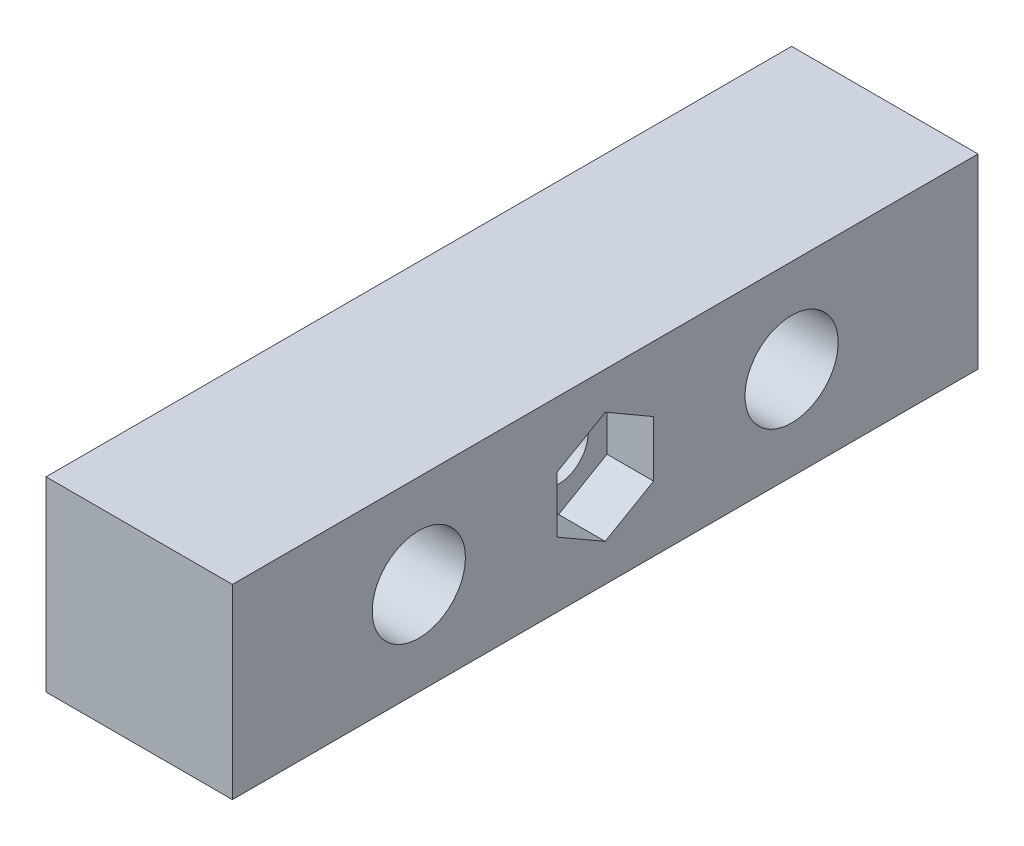
ISO-10303-21;
HEADER;
FILE_DESCRIPTION(('STEP AP214'),'2;1');
FILE_NAME('part.step','',(''),(''),'','','');
FILE_SCHEMA(('AUTOMOTIVE_DESIGN { 1 0 10303 214 1 1 1 1 }'));
ENDSEC;
DATA;
#1=APPLICATION_CONTEXT('core data for automotive mechanical design processes');
#2=APPLICATION_PROTOCOL_DEFINITION('international standard','automotive_design',2000,#1);
#3=PRODUCT_CONTEXT('',#1,'mechanical');
#4=PRODUCT('Part','Part','',(#3));
#5=PRODUCT_RELATED_PRODUCT_CATEGORY('part','',(#4));
#6=PRODUCT_DEFINITION_FORMATION('','',#4);
#7=PRODUCT_DEFINITION_CONTEXT('part definition',#1,'design');
#8=PRODUCT_DEFINITION('design','',#6,#7);
#9=PRODUCT_DEFINITION_SHAPE('','',#8);
#10=(LENGTH_UNIT() NAMED_UNIT(*) SI_UNIT(.MILLI.,.METRE.));
#11=(NAMED_UNIT(*) PLANE_ANGLE_UNIT() SI_UNIT($,.RADIAN.));
#12=(NAMED_UNIT(*) SI_UNIT($,.STERADIAN.) SOLID_ANGLE_UNIT());
#13=UNCERTAINTY_MEASURE_WITH_UNIT(LENGTH_MEASURE(1.E-05),#10,'distance_accuracy_value','');
#14=(GEOMETRIC_REPRESENTATION_CONTEXT(3) GLOBAL_UNCERTAINTY_ASSIGNED_CONTEXT((#13)) GLOBAL_UNIT_ASSIGNED_CONTEXT((#10,
#11,#12)) REPRESENTATION_CONTEXT('',''));
#15=CARTESIAN_POINT('',(0.,0.,0.));
#16=DIRECTION('',(0.,0.,1.));
#17=DIRECTION('',(1.,0.,0.));
#18=AXIS2_PLACEMENT_3D('',#15,#16,#17);
#19=CARTESIAN_POINT('',(-10.,10.,0.));
#20=DIRECTION('',(1.,0.,0.));
#21=DIRECTION('',(0.,0.,-1.));
#22=AXIS2_PLACEMENT_3D('',#19,#20,#21);
#23=CYLINDRICAL_SURFACE('',#22,3.175);
#24=CARTESIAN_POINT('',(5.,10.,0.));
#25=DIRECTION('',(1.,0.,0.));
#26=DIRECTION('',(0.,0.,-1.));
#27=AXIS2_PLACEMENT_3D('',#24,#25,#26);
#28=CIRCLE('',#27,3.175);
#29=CARTESIAN_POINT('',(5.,10.,-3.17500000000001));
#30=VERTEX_POINT('',#29);
#31=EDGE_CURVE('E243',#30,#30,#28,.F.);
#32=ORIENTED_EDGE('',*,*,#31,.F.);
#33=EDGE_LOOP('',(#32));
#34=FACE_BOUND('',#33,.T.);
#35=CARTESIAN_POINT('',(-5.,10.,0.));
#36=DIRECTION('',(-1.,0.,0.));
#37=DIRECTION('',(0.,0.,1.));
#38=AXIS2_PLACEMENT_3D('',#35,#36,#37);
#39=CIRCLE('',#38,3.175);
#40=CARTESIAN_POINT('',(-5.,10.,3.17499999999999));
#41=VERTEX_POINT('',#40);
#42=EDGE_CURVE('E41',#41,#41,#39,.F.);
#43=ORIENTED_EDGE('',*,*,#42,.F.);
#44=EDGE_LOOP('',(#43));
#45=FACE_BOUND('',#44,.T.);
#46=ADVANCED_FACE('F37',(#34,#45),#23,.F.);
#47=CARTESIAN_POINT('',(-10.,20.,40.));
#48=DIRECTION('',(1.,0.,0.));
#49=DIRECTION('',(0.,0.,-1.));
#50=AXIS2_PLACEMENT_3D('',#47,#48,#49);
#51=PLANE('',#50);
#52=DIRECTION('',(0.,0.,1.));
#53=VECTOR('',#52,1.);
#54=CARTESIAN_POINT('',(-10.,0.,40.));
#55=LINE('',#54,#53);
#56=CARTESIAN_POINT('',(-10.,0.,-40.));
#57=VERTEX_POINT('',#56);
#58=CARTESIAN_POINT('',(-10.,0.,40.));
#59=VERTEX_POINT('',#58);
#60=EDGE_CURVE('E281',#57,#59,#55,.T.);
#61=ORIENTED_EDGE('',*,*,#60,.T.);
#62=DIRECTION('',(0.,-1.,0.));
#63=VECTOR('',#62,1.);
#64=CARTESIAN_POINT('',(-10.,20.,40.));
#65=LINE('',#64,#63);
#66=CARTESIAN_POINT('',(-10.,20.,40.));
#67=VERTEX_POINT('',#66);
#68=EDGE_CURVE('E286',#67,#59,#65,.T.);
#69=ORIENTED_EDGE('',*,*,#68,.F.);
#70=DIRECTION('',(0.,0.,1.));
#71=VECTOR('',#70,1.);
#72=CARTESIAN_POINT('',(-10.,20.,40.));
#73=LINE('',#72,#71);
#74=CARTESIAN_POINT('',(-10.,20.,-40.));
#75=VERTEX_POINT('',#74);
#76=EDGE_CURVE('E272',#75,#67,#73,.T.);
#77=ORIENTED_EDGE('',*,*,#76,.F.);
#78=DIRECTION('',(0.,-1.,0.));
#79=VECTOR('',#78,1.);
#80=CARTESIAN_POINT('',(-10.,20.,-40.));
#81=LINE('',#80,#79);
#82=EDGE_CURVE('E46',#75,#57,#81,.T.);
#83=ORIENTED_EDGE('',*,*,#82,.T.);
#84=EDGE_LOOP('',(#61,#69,#77,#83));
#85=FACE_BOUND('',#84,.T.);
#86=CARTESIAN_POINT('',(-10.,10.,-20.));
#87=DIRECTION('',(1.,0.,0.));
#88=DIRECTION('',(0.,0.,1.));
#89=AXIS2_PLACEMENT_3D('',#86,#87,#88);
#90=CIRCLE('',#89,5.);
#91=CARTESIAN_POINT('',(-10.,10.,-15.));
#92=VERTEX_POINT('',#91);
#93=EDGE_CURVE('E260',#92,#92,#90,.T.);
#94=ORIENTED_EDGE('',*,*,#93,.T.);
#95=EDGE_LOOP('',(#94));
#96=FACE_BOUND('',#95,.T.);
#97=CARTESIAN_POINT('',(-10.,10.,20.));
#98=DIRECTION('',(1.,0.,0.));
#99=DIRECTION('',(0.,0.,-1.));
#100=AXIS2_PLACEMENT_3D('',#97,#98,#99);
#101=CIRCLE('',#100,5.);
#102=CARTESIAN_POINT('',(-10.,10.,15.));
#103=VERTEX_POINT('',#102);
#104=EDGE_CURVE('E253',#103,#103,#101,.T.);
#105=ORIENTED_EDGE('',*,*,#104,.T.);
#106=EDGE_LOOP('',(#105));
#107=FACE_BOUND('',#106,.T.);
#108=DIRECTION('',(0.,0.5,0.866025403784439));
#109=VECTOR('',#108,1.);
#110=CARTESIAN_POINT('',(-10.,13.,-5.19615242270664));
#111=LINE('',#110,#109);
#112=CARTESIAN_POINT('',(-10.,13.,-5.19615242270664));
#113=VERTEX_POINT('',#112);
#114=CARTESIAN_POINT('',(-10.,16.,0.));
#115=VERTEX_POINT('',#114);
#116=EDGE_CURVE('E54',#113,#115,#111,.T.);
#117=ORIENTED_EDGE('',*,*,#116,.T.);
#118=DIRECTION('',(0.,-0.5,0.866025403784438));
#119=VECTOR('',#118,1.);
#120=CARTESIAN_POINT('',(-10.,16.,0.));
#121=LINE('',#120,#119);
#122=CARTESIAN_POINT('',(-10.,13.,5.19615242270662));
#123=VERTEX_POINT('',#122);
#124=EDGE_CURVE('E174',#115,#123,#121,.T.);
#125=ORIENTED_EDGE('',*,*,#124,.T.);
#126=DIRECTION('',(0.,-1.,0.));
#127=VECTOR('',#126,1.);
#128=CARTESIAN_POINT('',(-10.,13.,5.19615242270662));
#129=LINE('',#128,#127);
#130=CARTESIAN_POINT('',(-10.,7.,5.19615242270662));
#131=VERTEX_POINT('',#130);
#132=EDGE_CURVE('E177',#123,#131,#129,.T.);
#133=ORIENTED_EDGE('',*,*,#132,.T.);
#134=DIRECTION('',(0.,-0.5,-0.866025403784438));
#135=VECTOR('',#134,1.);
#136=CARTESIAN_POINT('',(-10.,7.,5.19615242270662));
#137=LINE('',#136,#135);
#138=CARTESIAN_POINT('',(-10.,4.00000000000001,0.));
#139=VERTEX_POINT('',#138);
#140=EDGE_CURVE('E192',#131,#139,#137,.T.);
#141=ORIENTED_EDGE('',*,*,#140,.T.);
#142=DIRECTION('',(0.,0.5,-0.866025403784439));
#143=VECTOR('',#142,1.);
#144=CARTESIAN_POINT('',(-10.,4.00000000000001,0.));
#145=LINE('',#144,#143);
#146=CARTESIAN_POINT('',(-10.,7.,-5.19615242270664));
#147=VERTEX_POINT('',#146);
#148=EDGE_CURVE('E189',#139,#147,#145,.T.);
#149=ORIENTED_EDGE('',*,*,#148,.T.);
#150=DIRECTION('',(0.,1.,0.));
#151=VECTOR('',#150,1.);
#152=CARTESIAN_POINT('',(-10.,7.,-5.19615242270664));
#153=LINE('',#152,#151);
#154=EDGE_CURVE('E187',#147,#113,#153,.T.);
#155=ORIENTED_EDGE('',*,*,#154,.T.);
#156=EDGE_LOOP('',(#117,#125,#133,#141,#149,#155));
#157=FACE_BOUND('',#156,.T.);
#158=ADVANCED_FACE('F297',(#85,#96,#107,#157),#51,.F.);
#159=CARTESIAN_POINT('',(10.,20.,40.));
#160=DIRECTION('',(-1.,0.,0.));
#161=DIRECTION('',(0.,0.,1.));
#162=AXIS2_PLACEMENT_3D('',#159,#160,#161);
#163=PLANE('',#162);
#164=DIRECTION('',(0.,-0.5,0.866025403784438));
#165=VECTOR('',#164,1.);
#166=CARTESIAN_POINT('',(10.,16.,0.));
#167=LINE('',#166,#165);
#168=CARTESIAN_POINT('',(10.,16.,0.));
#169=VERTEX_POINT('',#168);
#170=CARTESIAN_POINT('',(10.,13.,5.19615242270662));
#171=VERTEX_POINT('',#170);
#172=EDGE_CURVE('E227',#169,#171,#167,.T.);
#173=ORIENTED_EDGE('',*,*,#172,.F.);
#174=DIRECTION('',(0.,0.5,0.866025403784439));
#175=VECTOR('',#174,1.);
#176=CARTESIAN_POINT('',(10.,13.,-5.19615242270664));
#177=LINE('',#176,#175);
#178=CARTESIAN_POINT('',(10.,13.,-5.19615242270664));
#179=VERTEX_POINT('',#178);
#180=EDGE_CURVE('E62',#179,#169,#177,.T.);
#181=ORIENTED_EDGE('',*,*,#180,.F.);
#182=DIRECTION('',(0.,1.,0.));
#183=VECTOR('',#182,1.);
#184=CARTESIAN_POINT('',(10.,7.,-5.19615242270664));
#185=LINE('',#184,#183);
#186=CARTESIAN_POINT('',(10.,7.,-5.19615242270664));
#187=VERTEX_POINT('',#186);
#188=EDGE_CURVE('E210',#187,#179,#185,.T.);
#189=ORIENTED_EDGE('',*,*,#188,.F.);
#190=DIRECTION('',(0.,0.5,-0.866025403784439));
#191=VECTOR('',#190,1.);
#192=CARTESIAN_POINT('',(10.,4.00000000000001,0.));
#193=LINE('',#192,#191);
#194=CARTESIAN_POINT('',(10.,4.00000000000001,0.));
#195=VERTEX_POINT('',#194);
#196=EDGE_CURVE('E236',#195,#187,#193,.T.);
#197=ORIENTED_EDGE('',*,*,#196,.F.);
#198=DIRECTION('',(0.,-0.5,-0.866025403784438));
#199=VECTOR('',#198,1.);
#200=CARTESIAN_POINT('',(10.,7.,5.19615242270662));
#201=LINE('',#200,#199);
#202=CARTESIAN_POINT('',(10.,7.,5.19615242270662));
#203=VERTEX_POINT('',#202);
#204=EDGE_CURVE('E233',#203,#195,#201,.T.);
#205=ORIENTED_EDGE('',*,*,#204,.F.);
#206=DIRECTION('',(0.,-1.,0.));
#207=VECTOR('',#206,1.);
#208=CARTESIAN_POINT('',(10.,13.,5.19615242270662));
#209=LINE('',#208,#207);
#210=EDGE_CURVE('E230',#171,#203,#209,.T.);
#211=ORIENTED_EDGE('',*,*,#210,.F.);
#212=EDGE_LOOP('',(#173,#181,#189,#197,#205,#211));
#213=FACE_BOUND('',#212,.T.);
#214=CARTESIAN_POINT('',(10.,10.,20.));
#215=DIRECTION('',(1.,0.,0.));
#216=DIRECTION('',(0.,0.,-1.));
#217=AXIS2_PLACEMENT_3D('',#214,#215,#216);
#218=CIRCLE('',#217,5.);
#219=CARTESIAN_POINT('',(10.,10.,15.));
#220=VERTEX_POINT('',#219);
#221=EDGE_CURVE('E257',#220,#220,#218,.T.);
#222=ORIENTED_EDGE('',*,*,#221,.F.);
#223=EDGE_LOOP('',(#222));
#224=FACE_BOUND('',#223,.T.);
#225=CARTESIAN_POINT('',(10.,10.,-20.));
#226=DIRECTION('',(1.,0.,0.));
#227=DIRECTION('',(0.,0.,1.));
#228=AXIS2_PLACEMENT_3D('',#225,#226,#227);
#229=CIRCLE('',#228,5.);
#230=CARTESIAN_POINT('',(10.,10.,-15.));
#231=VERTEX_POINT('',#230);
#232=EDGE_CURVE('E263',#231,#231,#229,.T.);
#233=ORIENTED_EDGE('',*,*,#232,.F.);
#234=EDGE_LOOP('',(#233));
#235=FACE_BOUND('',#234,.T.);
#236=DIRECTION('',(0.,0.,-1.));
#237=VECTOR('',#236,1.);
#238=CARTESIAN_POINT('',(10.,0.,40.));
#239=LINE('',#238,#237);
#240=CARTESIAN_POINT('',(10.,0.,40.));
#241=VERTEX_POINT('',#240);
#242=CARTESIAN_POINT('',(10.,0.,-40.));
#243=VERTEX_POINT('',#242);
#244=EDGE_CURVE('E256',#241,#243,#239,.T.);
#245=ORIENTED_EDGE('',*,*,#244,.T.);
#246=DIRECTION('',(0.,-1.,0.));
#247=VECTOR('',#246,1.);
#248=CARTESIAN_POINT('',(10.,20.,-40.));
#249=LINE('',#248,#247);
#250=CARTESIAN_POINT('',(10.,20.,-40.));
#251=VERTEX_POINT('',#250);
#252=EDGE_CURVE('E11',#251,#243,#249,.T.);
#253=ORIENTED_EDGE('',*,*,#252,.F.);
#254=DIRECTION('',(0.,0.,-1.));
#255=VECTOR('',#254,1.);
#256=CARTESIAN_POINT('',(10.,20.,40.));
#257=LINE('',#256,#255);
#258=CARTESIAN_POINT('',(10.,20.,40.));
#259=VERTEX_POINT('',#258);
#260=EDGE_CURVE('E266',#259,#251,#257,.T.);
#261=ORIENTED_EDGE('',*,*,#260,.F.);
#262=DIRECTION('',(0.,-1.,0.));
#263=VECTOR('',#262,1.);
#264=CARTESIAN_POINT('',(10.,20.,40.));
#265=LINE('',#264,#263);
#266=EDGE_CURVE('E276',#259,#241,#265,.T.);
#267=ORIENTED_EDGE('',*,*,#266,.T.);
#268=EDGE_LOOP('',(#245,#253,#261,#267));
#269=FACE_BOUND('',#268,.T.);
#270=ADVANCED_FACE('F39',(#213,#224,#235,#269),#163,.F.);
#271=CARTESIAN_POINT('',(-10.,20.,-40.));
#272=DIRECTION('',(0.,0.,1.));
#273=DIRECTION('',(1.,0.,0.));
#274=AXIS2_PLACEMENT_3D('',#271,#272,#273);
#275=PLANE('',#274);
#276=DIRECTION('',(-1.,0.,0.));
#277=VECTOR('',#276,1.);
#278=CARTESIAN_POINT('',(-10.,0.,-40.));
#279=LINE('',#278,#277);
#280=EDGE_CURVE('E279',#243,#57,#279,.T.);
#281=ORIENTED_EDGE('',*,*,#280,.T.);
#282=ORIENTED_EDGE('',*,*,#82,.F.);
#283=DIRECTION('',(-1.,0.,0.));
#284=VECTOR('',#283,1.);
#285=CARTESIAN_POINT('',(-10.,20.,-40.));
#286=LINE('',#285,#284);
#287=EDGE_CURVE('E269',#251,#75,#286,.T.);
#288=ORIENTED_EDGE('',*,*,#287,.F.);
#289=ORIENTED_EDGE('',*,*,#252,.T.);
#290=EDGE_LOOP('',(#281,#282,#288,#289));
#291=FACE_BOUND('',#290,.T.);
#292=ADVANCED_FACE('F371',(#291),#275,.F.);
#293=CARTESIAN_POINT('',(-10.,20.,40.));
#294=DIRECTION('',(0.,0.,-1.));
#295=DIRECTION('',(-1.,0.,0.));
#296=AXIS2_PLACEMENT_3D('',#293,#294,#295);
#297=PLANE('',#296);
#298=DIRECTION('',(1.,0.,0.));
#299=VECTOR('',#298,1.);
#300=CARTESIAN_POINT('',(-10.,0.,40.));
#301=LINE('',#300,#299);
#302=EDGE_CURVE('E270',#59,#241,#301,.T.);
#303=ORIENTED_EDGE('',*,*,#302,.T.);
#304=ORIENTED_EDGE('',*,*,#266,.F.);
#305=DIRECTION('',(1.,0.,0.));
#306=VECTOR('',#305,1.);
#307=CARTESIAN_POINT('',(-10.,20.,40.));
#308=LINE('',#307,#306);
#309=EDGE_CURVE('E274',#67,#259,#308,.T.);
#310=ORIENTED_EDGE('',*,*,#309,.F.);
#311=ORIENTED_EDGE('',*,*,#68,.T.);
#312=EDGE_LOOP('',(#303,#304,#310,#311));
#313=FACE_BOUND('',#312,.T.);
#314=ADVANCED_FACE('F364',(#313),#297,.F.);
#315=CARTESIAN_POINT('',(0.,20.,0.));
#316=DIRECTION('',(0.,-1.,0.));
#317=DIRECTION('',(0.,0.,-1.));
#318=AXIS2_PLACEMENT_3D('',#315,#316,#317);
#319=PLANE('',#318);
#320=ORIENTED_EDGE('',*,*,#260,.T.);
#321=ORIENTED_EDGE('',*,*,#287,.T.);
#322=ORIENTED_EDGE('',*,*,#76,.T.);
#323=ORIENTED_EDGE('',*,*,#309,.T.);
#324=EDGE_LOOP('',(#320,#321,#322,#323));
#325=FACE_BOUND('',#324,.T.);
#326=ADVANCED_FACE('F361',(#325),#319,.F.);
#327=CARTESIAN_POINT('',(0.,0.,0.));
#328=DIRECTION('',(0.,-1.,0.));
#329=DIRECTION('',(0.,0.,-1.));
#330=AXIS2_PLACEMENT_3D('',#327,#328,#329);
#331=PLANE('',#330);
#332=ORIENTED_EDGE('',*,*,#244,.F.);
#333=ORIENTED_EDGE('',*,*,#302,.F.);
#334=ORIENTED_EDGE('',*,*,#60,.F.);
#335=ORIENTED_EDGE('',*,*,#280,.F.);
#336=EDGE_LOOP('',(#332,#333,#334,#335));
#337=FACE_BOUND('',#336,.T.);
#338=ADVANCED_FACE('F359',(#337),#331,.T.);
#339=CARTESIAN_POINT('',(-10.,10.,-20.));
#340=DIRECTION('',(1.,0.,0.));
#341=DIRECTION('',(0.,0.,-1.));
#342=AXIS2_PLACEMENT_3D('',#339,#340,#341);
#343=CYLINDRICAL_SURFACE('',#342,5.);
#344=ORIENTED_EDGE('',*,*,#93,.F.);
#345=EDGE_LOOP('',(#344));
#346=FACE_BOUND('',#345,.T.);
#347=ORIENTED_EDGE('',*,*,#232,.T.);
#348=EDGE_LOOP('',(#347));
#349=FACE_BOUND('',#348,.T.);
#350=ADVANCED_FACE('F355',(#346,#349),#343,.F.);
#351=CARTESIAN_POINT('',(-10.,10.,20.));
#352=DIRECTION('',(1.,0.,0.));
#353=DIRECTION('',(0.,0.,-1.));
#354=AXIS2_PLACEMENT_3D('',#351,#352,#353);
#355=CYLINDRICAL_SURFACE('',#354,5.);
#356=ORIENTED_EDGE('',*,*,#104,.F.);
#357=EDGE_LOOP('',(#356));
#358=FACE_BOUND('',#357,.T.);
#359=ORIENTED_EDGE('',*,*,#221,.T.);
#360=EDGE_LOOP('',(#359));
#361=FACE_BOUND('',#360,.T.);
#362=ADVANCED_FACE('F334',(#358,#361),#355,.F.);
#363=CARTESIAN_POINT('',(5.,0.,0.));
#364=DIRECTION('',(1.,0.,0.));
#365=DIRECTION('',(0.,0.,-1.));
#366=AXIS2_PLACEMENT_3D('',#363,#364,#365);
#367=PLANE('',#366);
#368=DIRECTION('',(0.,0.5,0.866025403784439));
#369=VECTOR('',#368,1.);
#370=CARTESIAN_POINT('',(5.,13.,-5.19615242270664));
#371=LINE('',#370,#369);
#372=CARTESIAN_POINT('',(5.,13.,-5.19615242270664));
#373=VERTEX_POINT('',#372);
#374=CARTESIAN_POINT('',(5.,16.,0.));
#375=VERTEX_POINT('',#374);
#376=EDGE_CURVE('E206',#373,#375,#371,.T.);
#377=ORIENTED_EDGE('',*,*,#376,.T.);
#378=DIRECTION('',(0.,-0.5,0.866025403784438));
#379=VECTOR('',#378,1.);
#380=CARTESIAN_POINT('',(5.,16.,0.));
#381=LINE('',#380,#379);
#382=CARTESIAN_POINT('',(5.,13.,5.19615242270662));
#383=VERTEX_POINT('',#382);
#384=EDGE_CURVE('E209',#375,#383,#381,.T.);
#385=ORIENTED_EDGE('',*,*,#384,.T.);
#386=DIRECTION('',(0.,-1.,0.));
#387=VECTOR('',#386,1.);
#388=CARTESIAN_POINT('',(5.,13.,5.19615242270662));
#389=LINE('',#388,#387);
#390=CARTESIAN_POINT('',(5.,7.,5.19615242270662));
#391=VERTEX_POINT('',#390);
#392=EDGE_CURVE('E213',#383,#391,#389,.T.);
#393=ORIENTED_EDGE('',*,*,#392,.T.);
#394=DIRECTION('',(0.,-0.5,-0.866025403784438));
#395=VECTOR('',#394,1.);
#396=CARTESIAN_POINT('',(5.,7.,5.19615242270662));
#397=LINE('',#396,#395);
#398=CARTESIAN_POINT('',(5.,4.00000000000001,0.));
#399=VERTEX_POINT('',#398);
#400=EDGE_CURVE('E216',#391,#399,#397,.T.);
#401=ORIENTED_EDGE('',*,*,#400,.T.);
#402=DIRECTION('',(0.,0.5,-0.866025403784439));
#403=VECTOR('',#402,1.);
#404=CARTESIAN_POINT('',(5.,4.00000000000001,0.));
#405=LINE('',#404,#403);
#406=CARTESIAN_POINT('',(5.,7.,-5.19615242270664));
#407=VERTEX_POINT('',#406);
#408=EDGE_CURVE('E219',#399,#407,#405,.T.);
#409=ORIENTED_EDGE('',*,*,#408,.T.);
#410=DIRECTION('',(0.,1.,0.));
#411=VECTOR('',#410,1.);
#412=CARTESIAN_POINT('',(5.,7.,-5.19615242270664));
#413=LINE('',#412,#411);
#414=EDGE_CURVE('E222',#407,#373,#413,.T.);
#415=ORIENTED_EDGE('',*,*,#414,.T.);
#416=EDGE_LOOP('',(#377,#385,#393,#401,#409,#415));
#417=FACE_BOUND('',#416,.T.);
#418=ORIENTED_EDGE('',*,*,#31,.T.);
#419=EDGE_LOOP('',(#418));
#420=FACE_BOUND('',#419,.T.);
#421=ADVANCED_FACE('F293',(#417,#420),#367,.T.);
#422=CARTESIAN_POINT('',(5.,13.,-5.19615242270664));
#423=DIRECTION('',(0.,0.866025403784439,-0.5));
#424=DIRECTION('',(0.,0.5,0.866025403784439));
#425=AXIS2_PLACEMENT_3D('',#422,#423,#424);
#426=PLANE('',#425);
#427=ORIENTED_EDGE('',*,*,#180,.T.);
#428=DIRECTION('',(1.,0.,0.));
#429=VECTOR('',#428,1.);
#430=CARTESIAN_POINT('',(5.,16.,0.));
#431=LINE('',#430,#429);
#432=EDGE_CURVE('E225',#375,#169,#431,.T.);
#433=ORIENTED_EDGE('',*,*,#432,.F.);
#434=ORIENTED_EDGE('',*,*,#376,.F.);
#435=DIRECTION('',(1.,0.,0.));
#436=VECTOR('',#435,1.);
#437=CARTESIAN_POINT('',(5.,13.,-5.19615242270664));
#438=LINE('',#437,#436);
#439=EDGE_CURVE('E241',#373,#179,#438,.T.);
#440=ORIENTED_EDGE('',*,*,#439,.T.);
#441=EDGE_LOOP('',(#427,#433,#434,#440));
#442=FACE_BOUND('',#441,.T.);
#443=ADVANCED_FACE('F333',(#442),#426,.F.);
#444=CARTESIAN_POINT('',(5.,7.,-5.19615242270664));
#445=DIRECTION('',(0.,0.,-1.));
#446=DIRECTION('',(-1.,0.,0.));
#447=AXIS2_PLACEMENT_3D('',#444,#445,#446);
#448=PLANE('',#447);
#449=ORIENTED_EDGE('',*,*,#188,.T.);
#450=ORIENTED_EDGE('',*,*,#439,.F.);
#451=ORIENTED_EDGE('',*,*,#414,.F.);
#452=DIRECTION('',(1.,0.,0.));
#453=VECTOR('',#452,1.);
#454=CARTESIAN_POINT('',(5.,7.,-5.19615242270664));
#455=LINE('',#454,#453);
#456=EDGE_CURVE('E244',#407,#187,#455,.T.);
#457=ORIENTED_EDGE('',*,*,#456,.T.);
#458=EDGE_LOOP('',(#449,#450,#451,#457));
#459=FACE_BOUND('',#458,.T.);
#460=ADVANCED_FACE('F336',(#459),#448,.F.);
#461=CARTESIAN_POINT('',(5.,4.00000000000001,0.));
#462=DIRECTION('',(0.,-0.866025403784439,-0.5));
#463=DIRECTION('',(0.,0.5,-0.866025403784439));
#464=AXIS2_PLACEMENT_3D('',#461,#462,#463);
#465=PLANE('',#464);
#466=ORIENTED_EDGE('',*,*,#196,.T.);
#467=ORIENTED_EDGE('',*,*,#456,.F.);
#468=ORIENTED_EDGE('',*,*,#408,.F.);
#469=DIRECTION('',(1.,0.,0.));
#470=VECTOR('',#469,1.);
#471=CARTESIAN_POINT('',(5.,4.00000000000001,0.));
#472=LINE('',#471,#470);
#473=EDGE_CURVE('E246',#399,#195,#472,.T.);
#474=ORIENTED_EDGE('',*,*,#473,.T.);
#475=EDGE_LOOP('',(#466,#467,#468,#474));
#476=FACE_BOUND('',#475,.T.);
#477=ADVANCED_FACE('F339',(#476),#465,.F.);
#478=CARTESIAN_POINT('',(5.,7.,5.19615242270662));
#479=DIRECTION('',(0.,-0.866025403784439,0.5));
#480=DIRECTION('',(0.,-0.5,-0.866025403784439));
#481=AXIS2_PLACEMENT_3D('',#478,#479,#480);
#482=PLANE('',#481);
#483=ORIENTED_EDGE('',*,*,#204,.T.);
#484=ORIENTED_EDGE('',*,*,#473,.F.);
#485=ORIENTED_EDGE('',*,*,#400,.F.);
#486=DIRECTION('',(1.,0.,0.));
#487=VECTOR('',#486,1.);
#488=CARTESIAN_POINT('',(5.,7.,5.19615242270662));
#489=LINE('',#488,#487);
#490=EDGE_CURVE('E248',#391,#203,#489,.T.);
#491=ORIENTED_EDGE('',*,*,#490,.T.);
#492=EDGE_LOOP('',(#483,#484,#485,#491));
#493=FACE_BOUND('',#492,.T.);
#494=ADVANCED_FACE('F343',(#493),#482,.F.);
#495=CARTESIAN_POINT('',(5.,13.,5.19615242270662));
#496=DIRECTION('',(0.,0.,1.));
#497=DIRECTION('',(0.,-1.,0.));
#498=AXIS2_PLACEMENT_3D('',#495,#496,#497);
#499=PLANE('',#498);
#500=ORIENTED_EDGE('',*,*,#210,.T.);
#501=ORIENTED_EDGE('',*,*,#490,.F.);
#502=ORIENTED_EDGE('',*,*,#392,.F.);
#503=DIRECTION('',(1.,0.,0.));
#504=VECTOR('',#503,1.);
#505=CARTESIAN_POINT('',(5.,13.,5.19615242270662));
#506=LINE('',#505,#504);
#507=EDGE_CURVE('E250',#383,#171,#506,.T.);
#508=ORIENTED_EDGE('',*,*,#507,.T.);
#509=EDGE_LOOP('',(#500,#501,#502,#508));
#510=FACE_BOUND('',#509,.T.);
#511=ADVANCED_FACE('F310',(#510),#499,.F.);
#512=CARTESIAN_POINT('',(5.,16.,0.));
#513=DIRECTION('',(0.,0.866025403784438,0.5));
#514=DIRECTION('',(0.,-0.5,0.866025403784439));
#515=AXIS2_PLACEMENT_3D('',#512,#513,#514);
#516=PLANE('',#515);
#517=ORIENTED_EDGE('',*,*,#172,.T.);
#518=ORIENTED_EDGE('',*,*,#507,.F.);
#519=ORIENTED_EDGE('',*,*,#384,.F.);
#520=ORIENTED_EDGE('',*,*,#432,.T.);
#521=EDGE_LOOP('',(#517,#518,#519,#520));
#522=FACE_BOUND('',#521,.T.);
#523=ADVANCED_FACE('F302',(#522),#516,.F.);
#524=CARTESIAN_POINT('',(-5.,0.,0.));
#525=DIRECTION('',(-1.,0.,0.));
#526=DIRECTION('',(0.,0.,-1.));
#527=AXIS2_PLACEMENT_3D('',#524,#525,#526);
#528=PLANE('',#527);
#529=DIRECTION('',(0.,0.5,0.866025403784439));
#530=VECTOR('',#529,1.);
#531=CARTESIAN_POINT('',(-5.,13.,-5.19615242270664));
#532=LINE('',#531,#530);
#533=CARTESIAN_POINT('',(-5.,13.,-5.19615242270664));
#534=VERTEX_POINT('',#533);
#535=CARTESIAN_POINT('',(-5.,16.,0.));
#536=VERTEX_POINT('',#535);
#537=EDGE_CURVE('E164',#534,#536,#532,.T.);
#538=ORIENTED_EDGE('',*,*,#537,.F.);
#539=DIRECTION('',(0.,1.,0.));
#540=VECTOR('',#539,1.);
#541=CARTESIAN_POINT('',(-5.,7.,-5.19615242270664));
#542=LINE('',#541,#540);
#543=CARTESIAN_POINT('',(-5.,7.,-5.19615242270664));
#544=VERTEX_POINT('',#543);
#545=EDGE_CURVE('E154',#544,#534,#542,.T.);
#546=ORIENTED_EDGE('',*,*,#545,.F.);
#547=DIRECTION('',(0.,0.5,-0.866025403784439));
#548=VECTOR('',#547,1.);
#549=CARTESIAN_POINT('',(-5.,4.00000000000001,0.));
#550=LINE('',#549,#548);
#551=CARTESIAN_POINT('',(-5.,4.00000000000001,0.));
#552=VERTEX_POINT('',#551);
#553=EDGE_CURVE('E163',#552,#544,#550,.T.);
#554=ORIENTED_EDGE('',*,*,#553,.F.);
#555=DIRECTION('',(0.,-0.5,-0.866025403784438));
#556=VECTOR('',#555,1.);
#557=CARTESIAN_POINT('',(-5.,7.,5.19615242270662));
#558=LINE('',#557,#556);
#559=CARTESIAN_POINT('',(-5.,7.,5.19615242270662));
#560=VERTEX_POINT('',#559);
#561=EDGE_CURVE('E181',#560,#552,#558,.T.);
#562=ORIENTED_EDGE('',*,*,#561,.F.);
#563=DIRECTION('',(0.,-1.,0.));
#564=VECTOR('',#563,1.);
#565=CARTESIAN_POINT('',(-5.,13.,5.19615242270662));
#566=LINE('',#565,#564);
#567=CARTESIAN_POINT('',(-5.,13.,5.19615242270662));
#568=VERTEX_POINT('',#567);
#569=EDGE_CURVE('E183',#568,#560,#566,.T.);
#570=ORIENTED_EDGE('',*,*,#569,.F.);
#571=DIRECTION('',(0.,-0.5,0.866025403784438));
#572=VECTOR('',#571,1.);
#573=CARTESIAN_POINT('',(-5.,16.,0.));
#574=LINE('',#573,#572);
#575=EDGE_CURVE('E169',#536,#568,#574,.T.);
#576=ORIENTED_EDGE('',*,*,#575,.F.);
#577=EDGE_LOOP('',(#538,#546,#554,#562,#570,#576));
#578=FACE_BOUND('',#577,.T.);
#579=ORIENTED_EDGE('',*,*,#42,.T.);
#580=EDGE_LOOP('',(#579));
#581=FACE_BOUND('',#580,.T.);
#582=ADVANCED_FACE('F171',(#578,#581),#528,.T.);
#583=CARTESIAN_POINT('',(-5.,13.,-5.19615242270664));
#584=DIRECTION('',(0.,-0.866025403784439,0.5));
#585=DIRECTION('',(0.,-0.5,-0.866025403784439));
#586=AXIS2_PLACEMENT_3D('',#583,#584,#585);
#587=PLANE('',#586);
#588=ORIENTED_EDGE('',*,*,#116,.F.);
#589=DIRECTION('',(-1.,0.,0.));
#590=VECTOR('',#589,1.);
#591=CARTESIAN_POINT('',(-5.,13.,-5.19615242270664));
#592=LINE('',#591,#590);
#593=EDGE_CURVE('E157',#534,#113,#592,.T.);
#594=ORIENTED_EDGE('',*,*,#593,.F.);
#595=ORIENTED_EDGE('',*,*,#537,.T.);
#596=DIRECTION('',(-1.,0.,0.));
#597=VECTOR('',#596,1.);
#598=CARTESIAN_POINT('',(-5.,16.,0.));
#599=LINE('',#598,#597);
#600=EDGE_CURVE('E197',#536,#115,#599,.T.);
#601=ORIENTED_EDGE('',*,*,#600,.T.);
#602=EDGE_LOOP('',(#588,#594,#595,#601));
#603=FACE_BOUND('',#602,.T.);
#604=ADVANCED_FACE('F167',(#603),#587,.T.);
#605=CARTESIAN_POINT('',(-5.,16.,0.));
#606=DIRECTION('',(0.,-0.866025403784438,-0.5));
#607=DIRECTION('',(0.,0.5,-0.866025403784439));
#608=AXIS2_PLACEMENT_3D('',#605,#606,#607);
#609=PLANE('',#608);
#610=ORIENTED_EDGE('',*,*,#124,.F.);
#611=ORIENTED_EDGE('',*,*,#600,.F.);
#612=ORIENTED_EDGE('',*,*,#575,.T.);
#613=DIRECTION('',(-1.,0.,0.));
#614=VECTOR('',#613,1.);
#615=CARTESIAN_POINT('',(-5.,13.,5.19615242270662));
#616=LINE('',#615,#614);
#617=EDGE_CURVE('E199',#568,#123,#616,.T.);
#618=ORIENTED_EDGE('',*,*,#617,.T.);
#619=EDGE_LOOP('',(#610,#611,#612,#618));
#620=FACE_BOUND('',#619,.T.);
#621=ADVANCED_FACE('F308',(#620),#609,.T.);
#622=CARTESIAN_POINT('',(-5.,13.,5.19615242270662));
#623=DIRECTION('',(0.,0.,-1.));
#624=DIRECTION('',(0.,1.,0.));
#625=AXIS2_PLACEMENT_3D('',#622,#623,#624);
#626=PLANE('',#625);
#627=ORIENTED_EDGE('',*,*,#132,.F.);
#628=ORIENTED_EDGE('',*,*,#617,.F.);
#629=ORIENTED_EDGE('',*,*,#569,.T.);
#630=DIRECTION('',(-1.,0.,0.));
#631=VECTOR('',#630,1.);
#632=CARTESIAN_POINT('',(-5.,7.,5.19615242270662));
#633=LINE('',#632,#631);
#634=EDGE_CURVE('E201',#560,#131,#633,.T.);
#635=ORIENTED_EDGE('',*,*,#634,.T.);
#636=EDGE_LOOP('',(#627,#628,#629,#635));
#637=FACE_BOUND('',#636,.T.);
#638=ADVANCED_FACE('F316',(#637),#626,.T.);
#639=CARTESIAN_POINT('',(-5.,7.,5.19615242270662));
#640=DIRECTION('',(0.,0.866025403784439,-0.5));
#641=DIRECTION('',(0.,0.5,0.866025403784439));
#642=AXIS2_PLACEMENT_3D('',#639,#640,#641);
#643=PLANE('',#642);
#644=ORIENTED_EDGE('',*,*,#140,.F.);
#645=ORIENTED_EDGE('',*,*,#634,.F.);
#646=ORIENTED_EDGE('',*,*,#561,.T.);
#647=DIRECTION('',(-1.,0.,0.));
#648=VECTOR('',#647,1.);
#649=CARTESIAN_POINT('',(-5.,4.00000000000001,0.));
#650=LINE('',#649,#648);
#651=EDGE_CURVE('E203',#552,#139,#650,.T.);
#652=ORIENTED_EDGE('',*,*,#651,.T.);
#653=EDGE_LOOP('',(#644,#645,#646,#652));
#654=FACE_BOUND('',#653,.T.);
#655=ADVANCED_FACE('F320',(#654),#643,.T.);
#656=CARTESIAN_POINT('',(-5.,4.00000000000001,0.));
#657=DIRECTION('',(0.,0.866025403784439,0.5));
#658=DIRECTION('',(0.,-0.5,0.866025403784439));
#659=AXIS2_PLACEMENT_3D('',#656,#657,#658);
#660=PLANE('',#659);
#661=ORIENTED_EDGE('',*,*,#148,.F.);
#662=ORIENTED_EDGE('',*,*,#651,.F.);
#663=ORIENTED_EDGE('',*,*,#553,.T.);
#664=DIRECTION('',(-1.,0.,0.));
#665=VECTOR('',#664,1.);
#666=CARTESIAN_POINT('',(-5.,7.,-5.19615242270664));
#667=LINE('',#666,#665);
#668=EDGE_CURVE('E159',#544,#147,#667,.T.);
#669=ORIENTED_EDGE('',*,*,#668,.T.);
#670=EDGE_LOOP('',(#661,#662,#663,#669));
#671=FACE_BOUND('',#670,.T.);
#672=ADVANCED_FACE('F324',(#671),#660,.T.);
#673=CARTESIAN_POINT('',(-5.,7.,-5.19615242270664));
#674=DIRECTION('',(0.,0.,1.));
#675=DIRECTION('',(1.,0.,0.));
#676=AXIS2_PLACEMENT_3D('',#673,#674,#675);
#677=PLANE('',#676);
#678=ORIENTED_EDGE('',*,*,#154,.F.);
#679=ORIENTED_EDGE('',*,*,#668,.F.);
#680=ORIENTED_EDGE('',*,*,#545,.T.);
#681=ORIENTED_EDGE('',*,*,#593,.T.);
#682=EDGE_LOOP('',(#678,#679,#680,#681));
#683=FACE_BOUND('',#682,.T.);
#684=ADVANCED_FACE('F156',(#683),#677,.T.);
#685=CLOSED_SHELL('',(#46,#158,#270,#292,#314,#326,#338,#350,#362,#421,#443,#460,#477,#494,#511,
#523,#582,#604,#621,#638,#655,#672,#684));
#686=MANIFOLD_SOLID_BREP('B2',#685);
#687=ADVANCED_BREP_SHAPE_REPRESENTATION('',(#18,#686),#14);
#688=SHAPE_DEFINITION_REPRESENTATION(#9,#687);
ENDSEC;
END-ISO-10303-21;
